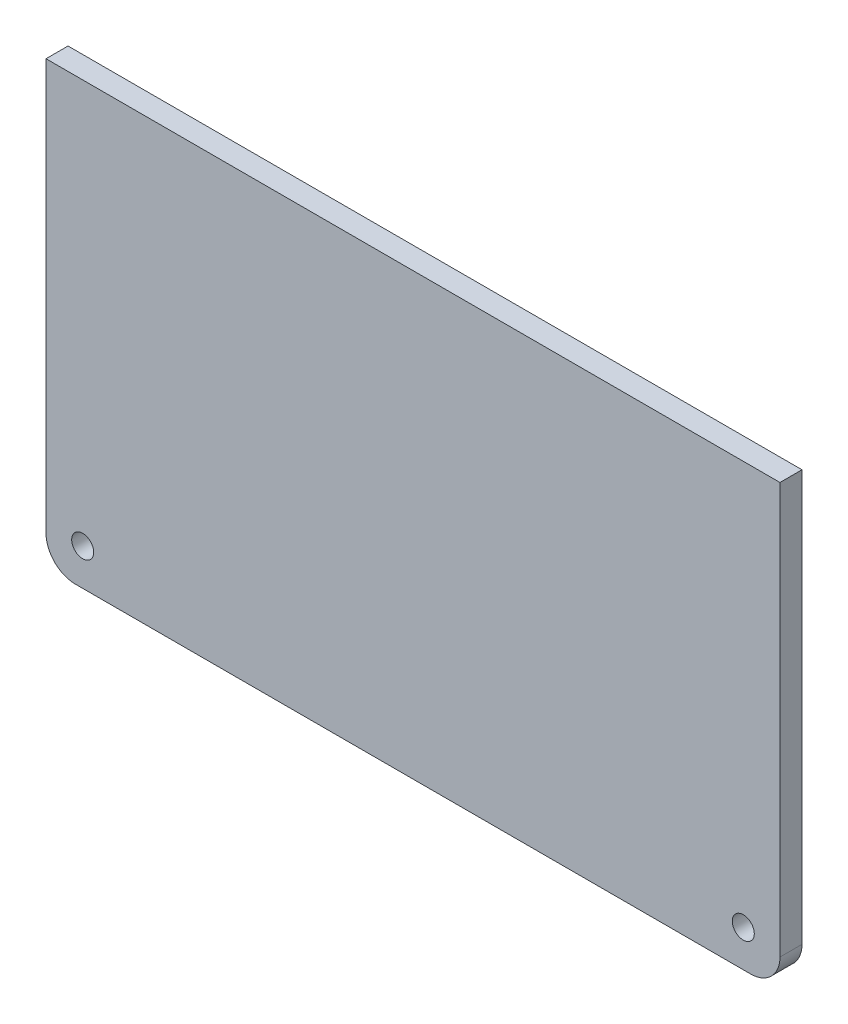
ISO-10303-21;
HEADER;
FILE_DESCRIPTION(('STEP AP214'),'2;1');
FILE_NAME('part.step','',(''),(''),'','','');
FILE_SCHEMA(('AUTOMOTIVE_DESIGN { 1 0 10303 214 1 1 1 1 }'));
ENDSEC;
DATA;
#1=APPLICATION_CONTEXT('core data for automotive mechanical design processes');
#2=APPLICATION_PROTOCOL_DEFINITION('international standard','automotive_design',2000,#1);
#3=PRODUCT_CONTEXT('',#1,'mechanical');
#4=PRODUCT('Part','Part','',(#3));
#5=PRODUCT_RELATED_PRODUCT_CATEGORY('part','',(#4));
#6=PRODUCT_DEFINITION_FORMATION('','',#4);
#7=PRODUCT_DEFINITION_CONTEXT('part definition',#1,'design');
#8=PRODUCT_DEFINITION('design','',#6,#7);
#9=PRODUCT_DEFINITION_SHAPE('','',#8);
#10=(LENGTH_UNIT() NAMED_UNIT(*) SI_UNIT(.MILLI.,.METRE.));
#11=(NAMED_UNIT(*) PLANE_ANGLE_UNIT() SI_UNIT($,.RADIAN.));
#12=(NAMED_UNIT(*) SI_UNIT($,.STERADIAN.) SOLID_ANGLE_UNIT());
#13=UNCERTAINTY_MEASURE_WITH_UNIT(LENGTH_MEASURE(1.E-05),#10,'distance_accuracy_value','');
#14=(GEOMETRIC_REPRESENTATION_CONTEXT(3) GLOBAL_UNCERTAINTY_ASSIGNED_CONTEXT((#13)) GLOBAL_UNIT_ASSIGNED_CONTEXT((#10,
#11,#12)) REPRESENTATION_CONTEXT('',''));
#15=CARTESIAN_POINT('',(0.,0.,0.));
#16=DIRECTION('',(0.,0.,1.));
#17=DIRECTION('',(1.,0.,0.));
#18=AXIS2_PLACEMENT_3D('',#15,#16,#17);
#19=CARTESIAN_POINT('',(-57.4955908289242,34.0388007054674,3.));
#20=DIRECTION('',(1.,0.,0.));
#21=DIRECTION('',(0.,0.,-1.));
#22=AXIS2_PLACEMENT_3D('',#19,#20,#21);
#23=PLANE('',#22);
#24=DIRECTION('',(0.,-1.,0.));
#25=VECTOR('',#24,1.);
#26=CARTESIAN_POINT('',(-57.4955908289242,34.0388007054674,0.));
#27=LINE('',#26,#25);
#28=CARTESIAN_POINT('',(-57.4955908289242,34.0388007054674,0.));
#29=VERTEX_POINT('',#28);
#30=CARTESIAN_POINT('',(-57.4955908289242,-21.9611992945326,0.));
#31=VERTEX_POINT('',#30);
#32=EDGE_CURVE('E132',#29,#31,#27,.T.);
#33=ORIENTED_EDGE('',*,*,#32,.T.);
#34=DIRECTION('',(0.,0.,-1.));
#35=VECTOR('',#34,1.);
#36=CARTESIAN_POINT('',(-57.4955908289242,-21.9611992945326,3.));
#37=LINE('',#36,#35);
#38=CARTESIAN_POINT('',(-57.4955908289242,-21.9611992945326,3.));
#39=VERTEX_POINT('',#38);
#40=EDGE_CURVE('E71',#31,#39,#37,.F.);
#41=ORIENTED_EDGE('',*,*,#40,.T.);
#42=DIRECTION('',(0.,-1.,0.));
#43=VECTOR('',#42,1.);
#44=CARTESIAN_POINT('',(-57.4955908289242,34.0388007054674,3.));
#45=LINE('',#44,#43);
#46=CARTESIAN_POINT('',(-57.4955908289242,34.0388007054674,3.));
#47=VERTEX_POINT('',#46);
#48=EDGE_CURVE('E144',#47,#39,#45,.T.);
#49=ORIENTED_EDGE('',*,*,#48,.F.);
#50=DIRECTION('',(0.,0.,-1.));
#51=VECTOR('',#50,1.);
#52=CARTESIAN_POINT('',(-57.4955908289242,34.0388007054674,3.));
#53=LINE('',#52,#51);
#54=EDGE_CURVE('E121',#47,#29,#53,.T.);
#55=ORIENTED_EDGE('',*,*,#54,.T.);
#56=EDGE_LOOP('',(#33,#41,#49,#55));
#57=FACE_BOUND('',#56,.T.);
#58=ADVANCED_FACE('F47',(#57),#23,.F.);
#59=CARTESIAN_POINT('',(-57.4955908289242,-25.9611992945326,3.));
#60=DIRECTION('',(0.,1.,0.));
#61=DIRECTION('',(0.,0.,1.));
#62=AXIS2_PLACEMENT_3D('',#59,#60,#61);
#63=PLANE('',#62);
#64=DIRECTION('',(1.,0.,0.));
#65=VECTOR('',#64,1.);
#66=CARTESIAN_POINT('',(-57.4955908289242,-25.9611992945326,3.));
#67=LINE('',#66,#65);
#68=CARTESIAN_POINT('',(-53.4955908289242,-25.9611992945326,3.));
#69=VERTEX_POINT('',#68);
#70=CARTESIAN_POINT('',(38.5044091710759,-25.9611992945326,3.));
#71=VERTEX_POINT('',#70);
#72=EDGE_CURVE('E110',#69,#71,#67,.T.);
#73=ORIENTED_EDGE('',*,*,#72,.F.);
#74=DIRECTION('',(0.,0.,-1.));
#75=VECTOR('',#74,1.);
#76=CARTESIAN_POINT('',(-53.4955908289242,-25.9611992945326,3.));
#77=LINE('',#76,#75);
#78=CARTESIAN_POINT('',(-53.4955908289242,-25.9611992945326,0.));
#79=VERTEX_POINT('',#78);
#80=EDGE_CURVE('E148',#69,#79,#77,.T.);
#81=ORIENTED_EDGE('',*,*,#80,.T.);
#82=DIRECTION('',(1.,0.,0.));
#83=VECTOR('',#82,1.);
#84=CARTESIAN_POINT('',(-57.4955908289242,-25.9611992945326,0.));
#85=LINE('',#84,#83);
#86=CARTESIAN_POINT('',(38.5044091710759,-25.9611992945326,0.));
#87=VERTEX_POINT('',#86);
#88=EDGE_CURVE('E135',#79,#87,#85,.T.);
#89=ORIENTED_EDGE('',*,*,#88,.T.);
#90=DIRECTION('',(0.,0.,-1.));
#91=VECTOR('',#90,1.);
#92=CARTESIAN_POINT('',(38.5044091710759,-25.9611992945326,3.));
#93=LINE('',#92,#91);
#94=EDGE_CURVE('E120',#87,#71,#93,.F.);
#95=ORIENTED_EDGE('',*,*,#94,.T.);
#96=EDGE_LOOP('',(#73,#81,#89,#95));
#97=FACE_BOUND('',#96,.T.);
#98=ADVANCED_FACE('F168',(#97),#63,.F.);
#99=CARTESIAN_POINT('',(42.5044091710758,34.0388007054674,3.));
#100=DIRECTION('',(-1.,0.,0.));
#101=DIRECTION('',(0.,-1.,0.));
#102=AXIS2_PLACEMENT_3D('',#99,#100,#101);
#103=PLANE('',#102);
#104=DIRECTION('',(0.,1.,0.));
#105=VECTOR('',#104,1.);
#106=CARTESIAN_POINT('',(42.5044091710758,34.0388007054674,3.));
#107=LINE('',#106,#105);
#108=CARTESIAN_POINT('',(42.5044091710759,-21.9611992945326,3.));
#109=VERTEX_POINT('',#108);
#110=CARTESIAN_POINT('',(42.5044091710758,34.0388007054674,3.));
#111=VERTEX_POINT('',#110);
#112=EDGE_CURVE('E101',#109,#111,#107,.T.);
#113=ORIENTED_EDGE('',*,*,#112,.F.);
#114=DIRECTION('',(0.,0.,-1.));
#115=VECTOR('',#114,1.);
#116=CARTESIAN_POINT('',(42.5044091710759,-21.9611992945326,3.));
#117=LINE('',#116,#115);
#118=CARTESIAN_POINT('',(42.5044091710759,-21.9611992945326,0.));
#119=VERTEX_POINT('',#118);
#120=EDGE_CURVE('E11',#109,#119,#117,.T.);
#121=ORIENTED_EDGE('',*,*,#120,.T.);
#122=DIRECTION('',(0.,1.,0.));
#123=VECTOR('',#122,1.);
#124=CARTESIAN_POINT('',(42.5044091710758,34.0388007054674,0.));
#125=LINE('',#124,#123);
#126=CARTESIAN_POINT('',(42.5044091710758,34.0388007054674,0.));
#127=VERTEX_POINT('',#126);
#128=EDGE_CURVE('E116',#119,#127,#125,.T.);
#129=ORIENTED_EDGE('',*,*,#128,.T.);
#130=DIRECTION('',(0.,0.,-1.));
#131=VECTOR('',#130,1.);
#132=CARTESIAN_POINT('',(42.5044091710758,34.0388007054674,3.));
#133=LINE('',#132,#131);
#134=EDGE_CURVE('E113',#111,#127,#133,.T.);
#135=ORIENTED_EDGE('',*,*,#134,.F.);
#136=EDGE_LOOP('',(#113,#121,#129,#135));
#137=FACE_BOUND('',#136,.T.);
#138=ADVANCED_FACE('F114',(#137),#103,.F.);
#139=CARTESIAN_POINT('',(-57.4955908289242,34.0388007054674,3.));
#140=DIRECTION('',(0.,-1.,0.));
#141=DIRECTION('',(0.,0.,-1.));
#142=AXIS2_PLACEMENT_3D('',#139,#140,#141);
#143=PLANE('',#142);
#144=DIRECTION('',(-1.,0.,0.));
#145=VECTOR('',#144,1.);
#146=CARTESIAN_POINT('',(-57.4955908289242,34.0388007054674,0.));
#147=LINE('',#146,#145);
#148=EDGE_CURVE('E142',#127,#29,#147,.T.);
#149=ORIENTED_EDGE('',*,*,#148,.T.);
#150=ORIENTED_EDGE('',*,*,#54,.F.);
#151=DIRECTION('',(-1.,0.,0.));
#152=VECTOR('',#151,1.);
#153=CARTESIAN_POINT('',(-57.4955908289242,34.0388007054674,3.));
#154=LINE('',#153,#152);
#155=EDGE_CURVE('E105',#111,#47,#154,.T.);
#156=ORIENTED_EDGE('',*,*,#155,.F.);
#157=ORIENTED_EDGE('',*,*,#134,.T.);
#158=EDGE_LOOP('',(#149,#150,#156,#157));
#159=FACE_BOUND('',#158,.T.);
#160=ADVANCED_FACE('F123',(#159),#143,.F.);
#161=CARTESIAN_POINT('',(0.,0.,3.));
#162=DIRECTION('',(0.,0.,1.));
#163=DIRECTION('',(1.,0.,0.));
#164=AXIS2_PLACEMENT_3D('',#161,#162,#163);
#165=PLANE('',#164);
#166=CARTESIAN_POINT('',(37.5044091710758,-20.9611992945325,3.));
#167=DIRECTION('',(0.,0.,1.));
#168=DIRECTION('',(1.,0.,0.));
#169=AXIS2_PLACEMENT_3D('',#166,#167,#168);
#170=CIRCLE('',#169,1.5);
#171=CARTESIAN_POINT('',(39.0044091710758,-20.9611992945325,3.));
#172=VERTEX_POINT('',#171);
#173=EDGE_CURVE('E185',#172,#172,#170,.T.);
#174=ORIENTED_EDGE('',*,*,#173,.F.);
#175=EDGE_LOOP('',(#174));
#176=FACE_BOUND('',#175,.T.);
#177=CARTESIAN_POINT('',(-52.5000254187247,-20.9611992945326,3.));
#178=DIRECTION('',(0.,0.,1.));
#179=DIRECTION('',(1.,0.,0.));
#180=AXIS2_PLACEMENT_3D('',#177,#178,#179);
#181=CIRCLE('',#180,1.5);
#182=CARTESIAN_POINT('',(-51.0000254187247,-20.9611992945326,3.));
#183=VERTEX_POINT('',#182);
#184=EDGE_CURVE('E182',#183,#183,#181,.T.);
#185=ORIENTED_EDGE('',*,*,#184,.F.);
#186=EDGE_LOOP('',(#185));
#187=FACE_BOUND('',#186,.T.);
#188=ORIENTED_EDGE('',*,*,#48,.T.);
#189=CARTESIAN_POINT('',(-53.4955908289242,-21.9611992945326,3.));
#190=DIRECTION('',(0.,0.,1.));
#191=DIRECTION('',(1.,0.,0.));
#192=AXIS2_PLACEMENT_3D('',#189,#190,#191);
#193=CIRCLE('',#192,4.);
#194=EDGE_CURVE('E56',#39,#69,#193,.T.);
#195=ORIENTED_EDGE('',*,*,#194,.T.);
#196=ORIENTED_EDGE('',*,*,#72,.T.);
#197=CARTESIAN_POINT('',(38.5044091710758,-21.9611992945326,3.));
#198=DIRECTION('',(0.,0.,1.));
#199=DIRECTION('',(1.,0.,0.));
#200=AXIS2_PLACEMENT_3D('',#197,#198,#199);
#201=CIRCLE('',#200,4.);
#202=EDGE_CURVE('E63',#71,#109,#201,.T.);
#203=ORIENTED_EDGE('',*,*,#202,.T.);
#204=ORIENTED_EDGE('',*,*,#112,.T.);
#205=ORIENTED_EDGE('',*,*,#155,.T.);
#206=EDGE_LOOP('',(#188,#195,#196,#203,#204,#205));
#207=FACE_BOUND('',#206,.T.);
#208=ADVANCED_FACE('F103',(#176,#187,#207),#165,.T.);
#209=CARTESIAN_POINT('',(0.,0.,0.));
#210=DIRECTION('',(0.,0.,1.));
#211=DIRECTION('',(1.,0.,0.));
#212=AXIS2_PLACEMENT_3D('',#209,#210,#211);
#213=PLANE('',#212);
#214=CARTESIAN_POINT('',(37.5044091710758,-20.9611992945325,0.));
#215=DIRECTION('',(0.,0.,1.));
#216=DIRECTION('',(1.,0.,0.));
#217=AXIS2_PLACEMENT_3D('',#214,#215,#216);
#218=CIRCLE('',#217,1.5);
#219=CARTESIAN_POINT('',(39.0044091710758,-20.9611992945325,0.));
#220=VERTEX_POINT('',#219);
#221=EDGE_CURVE('E136',#220,#220,#218,.T.);
#222=ORIENTED_EDGE('',*,*,#221,.T.);
#223=EDGE_LOOP('',(#222));
#224=FACE_BOUND('',#223,.T.);
#225=CARTESIAN_POINT('',(-52.5000254187247,-20.9611992945326,0.));
#226=DIRECTION('',(0.,0.,1.));
#227=DIRECTION('',(1.,0.,0.));
#228=AXIS2_PLACEMENT_3D('',#225,#226,#227);
#229=CIRCLE('',#228,1.5);
#230=CARTESIAN_POINT('',(-51.0000254187247,-20.9611992945326,0.));
#231=VERTEX_POINT('',#230);
#232=EDGE_CURVE('E178',#231,#231,#229,.T.);
#233=ORIENTED_EDGE('',*,*,#232,.T.);
#234=EDGE_LOOP('',(#233));
#235=FACE_BOUND('',#234,.T.);
#236=ORIENTED_EDGE('',*,*,#88,.F.);
#237=CARTESIAN_POINT('',(-53.4955908289242,-21.9611992945326,0.));
#238=DIRECTION('',(0.,0.,1.));
#239=DIRECTION('',(1.,0.,0.));
#240=AXIS2_PLACEMENT_3D('',#237,#238,#239);
#241=CIRCLE('',#240,4.);
#242=EDGE_CURVE('E155',#79,#31,#241,.F.);
#243=ORIENTED_EDGE('',*,*,#242,.T.);
#244=ORIENTED_EDGE('',*,*,#32,.F.);
#245=ORIENTED_EDGE('',*,*,#148,.F.);
#246=ORIENTED_EDGE('',*,*,#128,.F.);
#247=CARTESIAN_POINT('',(38.5044091710758,-21.9611992945326,0.));
#248=DIRECTION('',(0.,0.,1.));
#249=DIRECTION('',(1.,0.,0.));
#250=AXIS2_PLACEMENT_3D('',#247,#248,#249);
#251=CIRCLE('',#250,4.);
#252=EDGE_CURVE('E152',#119,#87,#251,.F.);
#253=ORIENTED_EDGE('',*,*,#252,.T.);
#254=EDGE_LOOP('',(#236,#243,#244,#245,#246,#253));
#255=FACE_BOUND('',#254,.T.);
#256=ADVANCED_FACE('F175',(#224,#235,#255),#213,.F.);
#257=CARTESIAN_POINT('',(-52.5000254187247,-20.9611992945326,0.));
#258=DIRECTION('',(0.,0.,1.));
#259=DIRECTION('',(1.,0.,0.));
#260=AXIS2_PLACEMENT_3D('',#257,#258,#259);
#261=CYLINDRICAL_SURFACE('',#260,1.5);
#262=ORIENTED_EDGE('',*,*,#232,.F.);
#263=EDGE_LOOP('',(#262));
#264=FACE_BOUND('',#263,.T.);
#265=ORIENTED_EDGE('',*,*,#184,.T.);
#266=EDGE_LOOP('',(#265));
#267=FACE_BOUND('',#266,.T.);
#268=ADVANCED_FACE('F198',(#264,#267),#261,.F.);
#269=CARTESIAN_POINT('',(37.5044091710758,-20.9611992945325,0.));
#270=DIRECTION('',(0.,0.,1.));
#271=DIRECTION('',(1.,0.,0.));
#272=AXIS2_PLACEMENT_3D('',#269,#270,#271);
#273=CYLINDRICAL_SURFACE('',#272,1.5);
#274=ORIENTED_EDGE('',*,*,#221,.F.);
#275=EDGE_LOOP('',(#274));
#276=FACE_BOUND('',#275,.T.);
#277=ORIENTED_EDGE('',*,*,#173,.T.);
#278=EDGE_LOOP('',(#277));
#279=FACE_BOUND('',#278,.T.);
#280=ADVANCED_FACE('F195',(#276,#279),#273,.F.);
#281=CARTESIAN_POINT('',(-53.4955908289242,-21.9611992945326,3.));
#282=DIRECTION('',(0.,0.,-1.));
#283=DIRECTION('',(-1.,0.,0.));
#284=AXIS2_PLACEMENT_3D('',#281,#282,#283);
#285=CYLINDRICAL_SURFACE('',#284,4.);
#286=ORIENTED_EDGE('',*,*,#194,.F.);
#287=ORIENTED_EDGE('',*,*,#40,.F.);
#288=ORIENTED_EDGE('',*,*,#242,.F.);
#289=ORIENTED_EDGE('',*,*,#80,.F.);
#290=EDGE_LOOP('',(#286,#287,#288,#289));
#291=FACE_BOUND('',#290,.T.);
#292=ADVANCED_FACE('F172',(#291),#285,.T.);
#293=CARTESIAN_POINT('',(38.5044091710758,-21.9611992945326,3.));
#294=DIRECTION('',(0.,0.,-1.));
#295=DIRECTION('',(-1.,0.,0.));
#296=AXIS2_PLACEMENT_3D('',#293,#294,#295);
#297=CYLINDRICAL_SURFACE('',#296,4.);
#298=ORIENTED_EDGE('',*,*,#202,.F.);
#299=ORIENTED_EDGE('',*,*,#94,.F.);
#300=ORIENTED_EDGE('',*,*,#252,.F.);
#301=ORIENTED_EDGE('',*,*,#120,.F.);
#302=EDGE_LOOP('',(#298,#299,#300,#301));
#303=FACE_BOUND('',#302,.T.);
#304=ADVANCED_FACE('F49',(#303),#297,.T.);
#305=CLOSED_SHELL('',(#58,#98,#138,#160,#208,#256,#268,#280,#292,#304));
#306=MANIFOLD_SOLID_BREP('B2',#305);
#307=ADVANCED_BREP_SHAPE_REPRESENTATION('',(#18,#306),#14);
#308=SHAPE_DEFINITION_REPRESENTATION(#9,#307);
ENDSEC;
END-ISO-10303-21;
